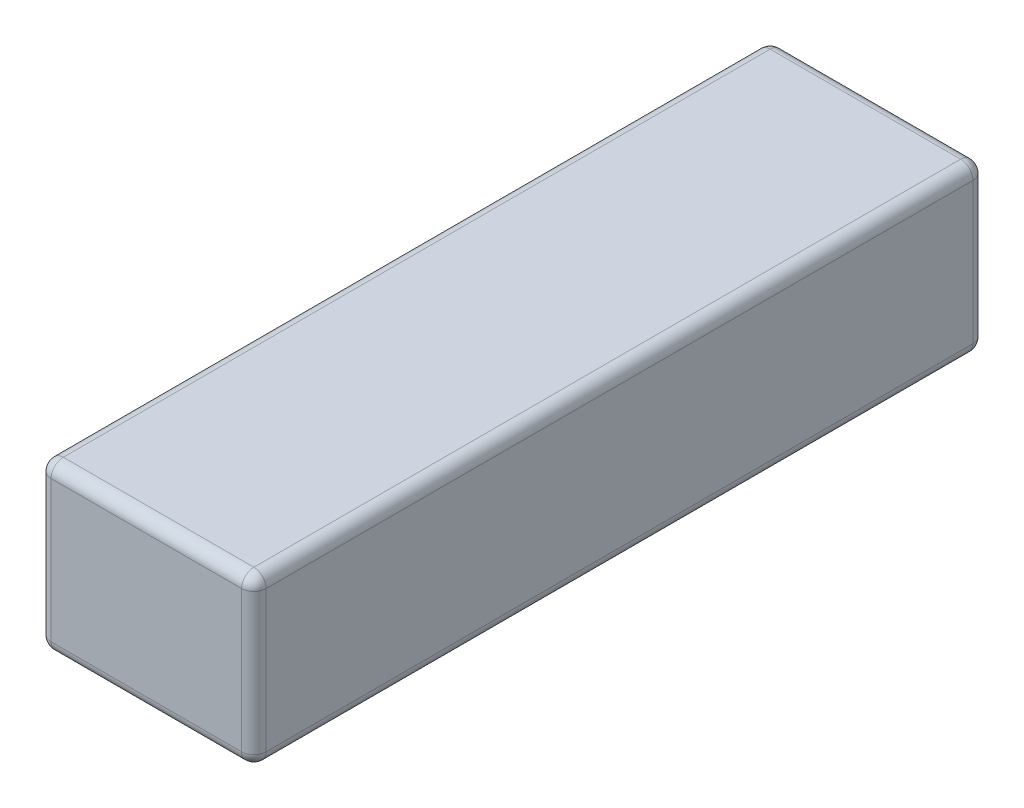
ISO-10303-21;
HEADER;
FILE_DESCRIPTION(('STEP AP214'),'2;1');
FILE_NAME('part.step','',(''),(''),'','','');
FILE_SCHEMA(('AUTOMOTIVE_DESIGN { 1 0 10303 214 1 1 1 1 }'));
ENDSEC;
DATA;
#1=APPLICATION_CONTEXT('core data for automotive mechanical design processes');
#2=APPLICATION_PROTOCOL_DEFINITION('international standard','automotive_design',2000,#1);
#3=PRODUCT_CONTEXT('',#1,'mechanical');
#4=PRODUCT('Part','Part','',(#3));
#5=PRODUCT_RELATED_PRODUCT_CATEGORY('part','',(#4));
#6=PRODUCT_DEFINITION_FORMATION('','',#4);
#7=PRODUCT_DEFINITION_CONTEXT('part definition',#1,'design');
#8=PRODUCT_DEFINITION('design','',#6,#7);
#9=PRODUCT_DEFINITION_SHAPE('','',#8);
#10=(LENGTH_UNIT() NAMED_UNIT(*) SI_UNIT(.MILLI.,.METRE.));
#11=(NAMED_UNIT(*) PLANE_ANGLE_UNIT() SI_UNIT($,.RADIAN.));
#12=(NAMED_UNIT(*) SI_UNIT($,.STERADIAN.) SOLID_ANGLE_UNIT());
#13=UNCERTAINTY_MEASURE_WITH_UNIT(LENGTH_MEASURE(1.E-05),#10,'distance_accuracy_value','');
#14=(GEOMETRIC_REPRESENTATION_CONTEXT(3) GLOBAL_UNCERTAINTY_ASSIGNED_CONTEXT((#13)) GLOBAL_UNIT_ASSIGNED_CONTEXT((#10,
#11,#12)) REPRESENTATION_CONTEXT('',''));
#15=CARTESIAN_POINT('',(0.,0.,0.));
#16=DIRECTION('',(0.,0.,1.));
#17=DIRECTION('',(1.,0.,0.));
#18=AXIS2_PLACEMENT_3D('',#15,#16,#17);
#19=CARTESIAN_POINT('',(-114.218920322243,54.8912600933029,119.));
#20=DIRECTION('',(1.,0.,0.));
#21=DIRECTION('',(0.,0.,-1.));
#22=AXIS2_PLACEMENT_3D('',#19,#20,#21);
#23=PLANE('',#22);
#24=DIRECTION('',(0.,-1.,0.));
#25=VECTOR('',#24,1.);
#26=CARTESIAN_POINT('',(-114.218920322243,54.8912600933029,2.));
#27=LINE('',#26,#25);
#28=CARTESIAN_POINT('',(-114.218920322243,52.8912600933029,2.));
#29=VERTEX_POINT('',#28);
#30=CARTESIAN_POINT('',(-114.218920322243,29.8912600933029,2.));
#31=VERTEX_POINT('',#30);
#32=EDGE_CURVE('E191',#29,#31,#27,.T.);
#33=ORIENTED_EDGE('',*,*,#32,.T.);
#34=DIRECTION('',(0.,0.,-1.));
#35=VECTOR('',#34,1.);
#36=CARTESIAN_POINT('',(-114.218920322243,29.8912600933029,119.));
#37=LINE('',#36,#35);
#38=CARTESIAN_POINT('',(-114.218920322243,29.8912600933029,117.));
#39=VERTEX_POINT('',#38);
#40=EDGE_CURVE('E194',#31,#39,#37,.F.);
#41=ORIENTED_EDGE('',*,*,#40,.T.);
#42=DIRECTION('',(0.,-1.,0.));
#43=VECTOR('',#42,1.);
#44=CARTESIAN_POINT('',(-114.218920322243,54.8912600933029,117.));
#45=LINE('',#44,#43);
#46=CARTESIAN_POINT('',(-114.218920322243,52.8912600933029,117.));
#47=VERTEX_POINT('',#46);
#48=EDGE_CURVE('E188',#39,#47,#45,.F.);
#49=ORIENTED_EDGE('',*,*,#48,.T.);
#50=DIRECTION('',(0.,0.,-1.));
#51=VECTOR('',#50,1.);
#52=CARTESIAN_POINT('',(-114.218920322243,52.8912600933029,119.));
#53=LINE('',#52,#51);
#54=EDGE_CURVE('E185',#47,#29,#53,.T.);
#55=ORIENTED_EDGE('',*,*,#54,.T.);
#56=EDGE_LOOP('',(#33,#41,#49,#55));
#57=FACE_BOUND('',#56,.T.);
#58=ADVANCED_FACE('F41',(#57),#23,.F.);
#59=CARTESIAN_POINT('',(-114.218920322243,27.8912600933029,119.));
#60=DIRECTION('',(0.,1.,0.));
#61=DIRECTION('',(0.,0.,1.));
#62=AXIS2_PLACEMENT_3D('',#59,#60,#61);
#63=PLANE('',#62);
#64=DIRECTION('',(0.,0.,-1.));
#65=VECTOR('',#64,1.);
#66=CARTESIAN_POINT('',(-112.218920322243,27.8912600933029,119.));
#67=LINE('',#66,#65);
#68=CARTESIAN_POINT('',(-112.218920322243,27.8912600933029,117.));
#69=VERTEX_POINT('',#68);
#70=CARTESIAN_POINT('',(-112.218920322243,27.8912600933029,2.));
#71=VERTEX_POINT('',#70);
#72=EDGE_CURVE('E166',#69,#71,#67,.T.);
#73=ORIENTED_EDGE('',*,*,#72,.T.);
#74=DIRECTION('',(1.,0.,0.));
#75=VECTOR('',#74,1.);
#76=CARTESIAN_POINT('',(-114.218920322243,27.8912600933029,2.));
#77=LINE('',#76,#75);
#78=CARTESIAN_POINT('',(-81.2189203222433,27.8912600933029,2.));
#79=VERTEX_POINT('',#78);
#80=EDGE_CURVE('E135',#71,#79,#77,.T.);
#81=ORIENTED_EDGE('',*,*,#80,.T.);
#82=DIRECTION('',(0.,0.,-1.));
#83=VECTOR('',#82,1.);
#84=CARTESIAN_POINT('',(-81.2189203222433,27.8912600933029,119.));
#85=LINE('',#84,#83);
#86=CARTESIAN_POINT('',(-81.2189203222433,27.8912600933029,117.));
#87=VERTEX_POINT('',#86);
#88=EDGE_CURVE('E155',#79,#87,#85,.F.);
#89=ORIENTED_EDGE('',*,*,#88,.T.);
#90=DIRECTION('',(1.,0.,0.));
#91=VECTOR('',#90,1.);
#92=CARTESIAN_POINT('',(-114.218920322243,27.8912600933029,117.));
#93=LINE('',#92,#91);
#94=EDGE_CURVE('E162',#87,#69,#93,.F.);
#95=ORIENTED_EDGE('',*,*,#94,.T.);
#96=EDGE_LOOP('',(#73,#81,#89,#95));
#97=FACE_BOUND('',#96,.T.);
#98=ADVANCED_FACE('F164',(#97),#63,.F.);
#99=CARTESIAN_POINT('',(-79.2189203222433,54.8912600933029,119.));
#100=DIRECTION('',(-1.,0.,0.));
#101=DIRECTION('',(0.,0.,1.));
#102=AXIS2_PLACEMENT_3D('',#99,#100,#101);
#103=PLANE('',#102);
#104=DIRECTION('',(0.,1.,0.));
#105=VECTOR('',#104,1.);
#106=CARTESIAN_POINT('',(-79.2189203222433,27.8912600933029,117.));
#107=LINE('',#106,#105);
#108=CARTESIAN_POINT('',(-79.2189203222433,52.8912600933029,117.));
#109=VERTEX_POINT('',#108);
#110=CARTESIAN_POINT('',(-79.2189203222433,29.8912600933029,117.));
#111=VERTEX_POINT('',#110);
#112=EDGE_CURVE('E217',#109,#111,#107,.F.);
#113=ORIENTED_EDGE('',*,*,#112,.T.);
#114=DIRECTION('',(0.,0.,-1.));
#115=VECTOR('',#114,1.);
#116=CARTESIAN_POINT('',(-79.2189203222433,29.8912600933029,119.));
#117=LINE('',#116,#115);
#118=CARTESIAN_POINT('',(-79.2189203222433,29.8912600933029,2.));
#119=VERTEX_POINT('',#118);
#120=EDGE_CURVE('E220',#111,#119,#117,.T.);
#121=ORIENTED_EDGE('',*,*,#120,.T.);
#122=DIRECTION('',(0.,1.,0.));
#123=VECTOR('',#122,1.);
#124=CARTESIAN_POINT('',(-79.2189203222433,54.8912600933029,2.));
#125=LINE('',#124,#123);
#126=CARTESIAN_POINT('',(-79.2189203222433,52.8912600933029,2.));
#127=VERTEX_POINT('',#126);
#128=EDGE_CURVE('E214',#119,#127,#125,.T.);
#129=ORIENTED_EDGE('',*,*,#128,.T.);
#130=DIRECTION('',(0.,0.,-1.));
#131=VECTOR('',#130,1.);
#132=CARTESIAN_POINT('',(-79.2189203222433,52.8912600933029,119.));
#133=LINE('',#132,#131);
#134=EDGE_CURVE('E211',#127,#109,#133,.F.);
#135=ORIENTED_EDGE('',*,*,#134,.T.);
#136=EDGE_LOOP('',(#113,#121,#129,#135));
#137=FACE_BOUND('',#136,.T.);
#138=ADVANCED_FACE('F384',(#137),#103,.F.);
#139=CARTESIAN_POINT('',(-114.218920322243,54.8912600933029,119.));
#140=DIRECTION('',(0.,-1.,0.));
#141=DIRECTION('',(0.,0.,-1.));
#142=AXIS2_PLACEMENT_3D('',#139,#140,#141);
#143=PLANE('',#142);
#144=DIRECTION('',(-1.,0.,0.));
#145=VECTOR('',#144,1.);
#146=CARTESIAN_POINT('',(-79.2189203222433,54.8912600933029,117.));
#147=LINE('',#146,#145);
#148=CARTESIAN_POINT('',(-112.218920322243,54.8912600933029,117.));
#149=VERTEX_POINT('',#148);
#150=CARTESIAN_POINT('',(-81.2189203222433,54.8912600933029,117.));
#151=VERTEX_POINT('',#150);
#152=EDGE_CURVE('E51',#149,#151,#147,.F.);
#153=ORIENTED_EDGE('',*,*,#152,.T.);
#154=DIRECTION('',(0.,0.,-1.));
#155=VECTOR('',#154,1.);
#156=CARTESIAN_POINT('',(-81.2189203222433,54.8912600933029,119.));
#157=LINE('',#156,#155);
#158=CARTESIAN_POINT('',(-81.2189203222433,54.8912600933029,2.));
#159=VERTEX_POINT('',#158);
#160=EDGE_CURVE('E11',#151,#159,#157,.T.);
#161=ORIENTED_EDGE('',*,*,#160,.T.);
#162=DIRECTION('',(-1.,0.,0.));
#163=VECTOR('',#162,1.);
#164=CARTESIAN_POINT('',(-114.218920322243,54.8912600933029,2.));
#165=LINE('',#164,#163);
#166=CARTESIAN_POINT('',(-112.218920322243,54.8912600933029,2.));
#167=VERTEX_POINT('',#166);
#168=EDGE_CURVE('E224',#159,#167,#165,.T.);
#169=ORIENTED_EDGE('',*,*,#168,.T.);
#170=DIRECTION('',(0.,0.,-1.));
#171=VECTOR('',#170,1.);
#172=CARTESIAN_POINT('',(-112.218920322243,54.8912600933029,119.));
#173=LINE('',#172,#171);
#174=EDGE_CURVE('E62',#167,#149,#173,.F.);
#175=ORIENTED_EDGE('',*,*,#174,.T.);
#176=EDGE_LOOP('',(#153,#161,#169,#175));
#177=FACE_BOUND('',#176,.T.);
#178=ADVANCED_FACE('F350',(#177),#143,.F.);
#179=CARTESIAN_POINT('',(0.,0.,119.));
#180=DIRECTION('',(0.,0.,1.));
#181=DIRECTION('',(1.,0.,0.));
#182=AXIS2_PLACEMENT_3D('',#179,#180,#181);
#183=PLANE('',#182);
#184=DIRECTION('',(0.,-1.,0.));
#185=VECTOR('',#184,1.);
#186=CARTESIAN_POINT('',(-112.218920322243,27.8912600933029,119.));
#187=LINE('',#186,#185);
#188=CARTESIAN_POINT('',(-112.218920322243,52.8912600933029,119.));
#189=VERTEX_POINT('',#188);
#190=CARTESIAN_POINT('',(-112.218920322243,29.8912600933029,119.));
#191=VERTEX_POINT('',#190);
#192=EDGE_CURVE('E204',#189,#191,#187,.T.);
#193=ORIENTED_EDGE('',*,*,#192,.T.);
#194=DIRECTION('',(1.,0.,0.));
#195=VECTOR('',#194,1.);
#196=CARTESIAN_POINT('',(-79.2189203222433,29.8912600933029,119.));
#197=LINE('',#196,#195);
#198=CARTESIAN_POINT('',(-81.2189203222433,29.8912600933029,119.));
#199=VERTEX_POINT('',#198);
#200=EDGE_CURVE('E207',#191,#199,#197,.T.);
#201=ORIENTED_EDGE('',*,*,#200,.T.);
#202=DIRECTION('',(0.,1.,0.));
#203=VECTOR('',#202,1.);
#204=CARTESIAN_POINT('',(-81.2189203222433,54.8912600933029,119.));
#205=LINE('',#204,#203);
#206=CARTESIAN_POINT('',(-81.2189203222433,52.8912600933029,119.));
#207=VERTEX_POINT('',#206);
#208=EDGE_CURVE('E201',#199,#207,#205,.T.);
#209=ORIENTED_EDGE('',*,*,#208,.T.);
#210=DIRECTION('',(-1.,0.,0.));
#211=VECTOR('',#210,1.);
#212=CARTESIAN_POINT('',(-114.218920322243,52.8912600933029,119.));
#213=LINE('',#212,#211);
#214=EDGE_CURVE('E198',#207,#189,#213,.T.);
#215=ORIENTED_EDGE('',*,*,#214,.T.);
#216=EDGE_LOOP('',(#193,#201,#209,#215));
#217=FACE_BOUND('',#216,.T.);
#218=ADVANCED_FACE('F331',(#217),#183,.T.);
#219=CARTESIAN_POINT('',(0.,0.,0.));
#220=DIRECTION('',(0.,0.,1.));
#221=DIRECTION('',(1.,0.,0.));
#222=AXIS2_PLACEMENT_3D('',#219,#220,#221);
#223=PLANE('',#222);
#224=DIRECTION('',(0.,1.,0.));
#225=VECTOR('',#224,1.);
#226=CARTESIAN_POINT('',(-81.2189203222433,0.,0.));
#227=LINE('',#226,#225);
#228=CARTESIAN_POINT('',(-81.2189203222433,52.8912600933029,0.));
#229=VERTEX_POINT('',#228);
#230=CARTESIAN_POINT('',(-81.2189203222433,29.8912600933029,0.));
#231=VERTEX_POINT('',#230);
#232=EDGE_CURVE('E173',#229,#231,#227,.F.);
#233=ORIENTED_EDGE('',*,*,#232,.T.);
#234=DIRECTION('',(1.,0.,0.));
#235=VECTOR('',#234,1.);
#236=CARTESIAN_POINT('',(0.,29.8912600933029,0.));
#237=LINE('',#236,#235);
#238=CARTESIAN_POINT('',(-112.218920322243,29.8912600933029,0.));
#239=VERTEX_POINT('',#238);
#240=EDGE_CURVE('E137',#231,#239,#237,.F.);
#241=ORIENTED_EDGE('',*,*,#240,.T.);
#242=DIRECTION('',(0.,-1.,0.));
#243=VECTOR('',#242,1.);
#244=CARTESIAN_POINT('',(-112.218920322243,0.,0.));
#245=LINE('',#244,#243);
#246=CARTESIAN_POINT('',(-112.218920322243,52.8912600933029,0.));
#247=VERTEX_POINT('',#246);
#248=EDGE_CURVE('E180',#239,#247,#245,.F.);
#249=ORIENTED_EDGE('',*,*,#248,.T.);
#250=DIRECTION('',(-1.,0.,0.));
#251=VECTOR('',#250,1.);
#252=CARTESIAN_POINT('',(0.,52.8912600933029,0.));
#253=LINE('',#252,#251);
#254=EDGE_CURVE('E169',#247,#229,#253,.F.);
#255=ORIENTED_EDGE('',*,*,#254,.T.);
#256=EDGE_LOOP('',(#233,#241,#249,#255));
#257=FACE_BOUND('',#256,.T.);
#258=ADVANCED_FACE('F410',(#257),#223,.F.);
#259=CARTESIAN_POINT('',(0.,52.8912600933029,117.));
#260=DIRECTION('',(1.,0.,0.));
#261=DIRECTION('',(0.,0.,-1.));
#262=AXIS2_PLACEMENT_3D('',#259,#260,#261);
#263=CYLINDRICAL_SURFACE('',#262,2.);
#264=CARTESIAN_POINT('',(-112.218920322243,52.8912600933029,117.));
#265=DIRECTION('',(-1.,0.,0.));
#266=DIRECTION('',(0.,0.,1.));
#267=AXIS2_PLACEMENT_3D('',#264,#265,#266);
#268=CIRCLE('',#267,2.);
#269=EDGE_CURVE('E45',#189,#149,#268,.T.);
#270=ORIENTED_EDGE('',*,*,#269,.F.);
#271=ORIENTED_EDGE('',*,*,#214,.F.);
#272=CARTESIAN_POINT('',(-81.2189203222433,52.8912600933029,117.));
#273=DIRECTION('',(1.,0.,0.));
#274=DIRECTION('',(0.,0.,-1.));
#275=AXIS2_PLACEMENT_3D('',#272,#273,#274);
#276=CIRCLE('',#275,2.);
#277=EDGE_CURVE('E300',#151,#207,#276,.T.);
#278=ORIENTED_EDGE('',*,*,#277,.F.);
#279=ORIENTED_EDGE('',*,*,#152,.F.);
#280=EDGE_LOOP('',(#270,#271,#278,#279));
#281=FACE_BOUND('',#280,.T.);
#282=ADVANCED_FACE('F43',(#281),#263,.T.);
#283=CARTESIAN_POINT('',(-112.218920322243,52.8912600933029,117.));
#284=DIRECTION('',(0.,0.,1.));
#285=DIRECTION('',(1.,0.,0.));
#286=AXIS2_PLACEMENT_3D('',#283,#284,#285);
#287=SPHERICAL_SURFACE('',#286,2.);
#288=CARTESIAN_POINT('',(-112.218920322243,52.8912600933029,117.));
#289=DIRECTION('',(0.,1.,0.));
#290=DIRECTION('',(0.,0.,1.));
#291=AXIS2_PLACEMENT_3D('',#288,#289,#290);
#292=CIRCLE('',#291,2.);
#293=EDGE_CURVE('E293',#189,#47,#292,.F.);
#294=ORIENTED_EDGE('',*,*,#293,.F.);
#295=ORIENTED_EDGE('',*,*,#269,.T.);
#296=CARTESIAN_POINT('',(-112.218920322243,52.8912600933029,117.));
#297=DIRECTION('',(0.,0.,1.));
#298=DIRECTION('',(1.,0.,0.));
#299=AXIS2_PLACEMENT_3D('',#296,#297,#298);
#300=CIRCLE('',#299,2.);
#301=EDGE_CURVE('E297',#47,#149,#300,.F.);
#302=ORIENTED_EDGE('',*,*,#301,.F.);
#303=EDGE_LOOP('',(#294,#295,#302));
#304=FACE_BOUND('',#303,.T.);
#305=ADVANCED_FACE('F312',(#304),#287,.T.);
#306=CARTESIAN_POINT('',(-81.2189203222433,52.8912600933029,117.));
#307=DIRECTION('',(0.,0.,1.));
#308=DIRECTION('',(1.,0.,0.));
#309=AXIS2_PLACEMENT_3D('',#306,#307,#308);
#310=SPHERICAL_SURFACE('',#309,2.);
#311=CARTESIAN_POINT('',(-81.2189203222433,52.8912600933029,117.));
#312=DIRECTION('',(0.,0.,1.));
#313=DIRECTION('',(1.,0.,0.));
#314=AXIS2_PLACEMENT_3D('',#311,#312,#313);
#315=CIRCLE('',#314,2.);
#316=EDGE_CURVE('E285',#151,#109,#315,.F.);
#317=ORIENTED_EDGE('',*,*,#316,.F.);
#318=ORIENTED_EDGE('',*,*,#277,.T.);
#319=CARTESIAN_POINT('',(-81.2189203222433,52.8912600933029,117.));
#320=DIRECTION('',(0.,1.,0.));
#321=DIRECTION('',(0.,0.,1.));
#322=AXIS2_PLACEMENT_3D('',#319,#320,#321);
#323=CIRCLE('',#322,2.);
#324=EDGE_CURVE('E289',#109,#207,#323,.F.);
#325=ORIENTED_EDGE('',*,*,#324,.F.);
#326=EDGE_LOOP('',(#317,#318,#325));
#327=FACE_BOUND('',#326,.T.);
#328=ADVANCED_FACE('F344',(#327),#310,.T.);
#329=CARTESIAN_POINT('',(-112.218920322243,52.8912600933029,119.));
#330=DIRECTION('',(0.,0.,-1.));
#331=DIRECTION('',(-1.,0.,0.));
#332=AXIS2_PLACEMENT_3D('',#329,#330,#331);
#333=CYLINDRICAL_SURFACE('',#332,2.);
#334=ORIENTED_EDGE('',*,*,#301,.T.);
#335=ORIENTED_EDGE('',*,*,#174,.F.);
#336=CARTESIAN_POINT('',(-112.218920322243,52.8912600933029,2.));
#337=DIRECTION('',(0.,0.,-1.));
#338=DIRECTION('',(-1.,0.,0.));
#339=AXIS2_PLACEMENT_3D('',#336,#337,#338);
#340=CIRCLE('',#339,2.);
#341=EDGE_CURVE('E277',#29,#167,#340,.T.);
#342=ORIENTED_EDGE('',*,*,#341,.F.);
#343=ORIENTED_EDGE('',*,*,#54,.F.);
#344=EDGE_LOOP('',(#334,#335,#342,#343));
#345=FACE_BOUND('',#344,.T.);
#346=ADVANCED_FACE('F318',(#345),#333,.T.);
#347=CARTESIAN_POINT('',(-112.218920322243,0.,117.));
#348=DIRECTION('',(0.,1.,0.));
#349=DIRECTION('',(0.,0.,1.));
#350=AXIS2_PLACEMENT_3D('',#347,#348,#349);
#351=CYLINDRICAL_SURFACE('',#350,2.);
#352=ORIENTED_EDGE('',*,*,#293,.T.);
#353=ORIENTED_EDGE('',*,*,#48,.F.);
#354=CARTESIAN_POINT('',(-112.218920322243,29.8912600933029,117.));
#355=DIRECTION('',(0.,-1.,0.));
#356=DIRECTION('',(0.,0.,-1.));
#357=AXIS2_PLACEMENT_3D('',#354,#355,#356);
#358=CIRCLE('',#357,2.);
#359=EDGE_CURVE('E273',#191,#39,#358,.T.);
#360=ORIENTED_EDGE('',*,*,#359,.F.);
#361=ORIENTED_EDGE('',*,*,#192,.F.);
#362=EDGE_LOOP('',(#352,#353,#360,#361));
#363=FACE_BOUND('',#362,.T.);
#364=ADVANCED_FACE('F328',(#363),#351,.T.);
#365=CARTESIAN_POINT('',(0.,29.8912600933029,117.));
#366=DIRECTION('',(-1.,0.,0.));
#367=DIRECTION('',(0.,0.,1.));
#368=AXIS2_PLACEMENT_3D('',#365,#366,#367);
#369=CYLINDRICAL_SURFACE('',#368,2.);
#370=CARTESIAN_POINT('',(-81.2189203222433,29.8912600933029,117.));
#371=DIRECTION('',(1.,0.,0.));
#372=DIRECTION('',(0.,0.,-1.));
#373=AXIS2_PLACEMENT_3D('',#370,#371,#372);
#374=CIRCLE('',#373,2.);
#375=EDGE_CURVE('E265',#199,#87,#374,.T.);
#376=ORIENTED_EDGE('',*,*,#375,.F.);
#377=ORIENTED_EDGE('',*,*,#200,.F.);
#378=CARTESIAN_POINT('',(-112.218920322243,29.8912600933029,117.));
#379=DIRECTION('',(-1.,0.,0.));
#380=DIRECTION('',(0.,0.,1.));
#381=AXIS2_PLACEMENT_3D('',#378,#379,#380);
#382=CIRCLE('',#381,2.);
#383=EDGE_CURVE('E269',#69,#191,#382,.T.);
#384=ORIENTED_EDGE('',*,*,#383,.F.);
#385=ORIENTED_EDGE('',*,*,#94,.F.);
#386=EDGE_LOOP('',(#376,#377,#384,#385));
#387=FACE_BOUND('',#386,.T.);
#388=ADVANCED_FACE('F335',(#387),#369,.T.);
#389=CARTESIAN_POINT('',(-81.2189203222433,0.,117.));
#390=DIRECTION('',(0.,-1.,0.));
#391=DIRECTION('',(0.,0.,-1.));
#392=AXIS2_PLACEMENT_3D('',#389,#390,#391);
#393=CYLINDRICAL_SURFACE('',#392,2.);
#394=ORIENTED_EDGE('',*,*,#324,.T.);
#395=ORIENTED_EDGE('',*,*,#208,.F.);
#396=CARTESIAN_POINT('',(-81.2189203222433,29.8912600933029,117.));
#397=DIRECTION('',(0.,-1.,0.));
#398=DIRECTION('',(0.,0.,-1.));
#399=AXIS2_PLACEMENT_3D('',#396,#397,#398);
#400=CIRCLE('',#399,2.);
#401=EDGE_CURVE('E262',#111,#199,#400,.T.);
#402=ORIENTED_EDGE('',*,*,#401,.F.);
#403=ORIENTED_EDGE('',*,*,#112,.F.);
#404=EDGE_LOOP('',(#394,#395,#402,#403));
#405=FACE_BOUND('',#404,.T.);
#406=ADVANCED_FACE('F341',(#405),#393,.T.);
#407=CARTESIAN_POINT('',(-81.2189203222433,52.8912600933029,119.));
#408=DIRECTION('',(0.,0.,-1.));
#409=DIRECTION('',(-1.,0.,0.));
#410=AXIS2_PLACEMENT_3D('',#407,#408,#409);
#411=CYLINDRICAL_SURFACE('',#410,2.);
#412=ORIENTED_EDGE('',*,*,#316,.T.);
#413=ORIENTED_EDGE('',*,*,#134,.F.);
#414=CARTESIAN_POINT('',(-81.2189203222433,52.8912600933029,2.));
#415=DIRECTION('',(0.,0.,-1.));
#416=DIRECTION('',(-1.,0.,0.));
#417=AXIS2_PLACEMENT_3D('',#414,#415,#416);
#418=CIRCLE('',#417,2.);
#419=EDGE_CURVE('E258',#159,#127,#418,.T.);
#420=ORIENTED_EDGE('',*,*,#419,.F.);
#421=ORIENTED_EDGE('',*,*,#160,.F.);
#422=EDGE_LOOP('',(#412,#413,#420,#421));
#423=FACE_BOUND('',#422,.T.);
#424=ADVANCED_FACE('F348',(#423),#411,.T.);
#425=CARTESIAN_POINT('',(-114.218920322243,52.8912600933029,2.));
#426=DIRECTION('',(-1.,0.,0.));
#427=DIRECTION('',(0.,0.,1.));
#428=AXIS2_PLACEMENT_3D('',#425,#426,#427);
#429=CYLINDRICAL_SURFACE('',#428,2.);
#430=CARTESIAN_POINT('',(-112.218920322243,52.8912600933029,2.));
#431=DIRECTION('',(-1.,0.,0.));
#432=DIRECTION('',(0.,0.,1.));
#433=AXIS2_PLACEMENT_3D('',#430,#431,#432);
#434=CIRCLE('',#433,2.);
#435=EDGE_CURVE('E281',#167,#247,#434,.T.);
#436=ORIENTED_EDGE('',*,*,#435,.F.);
#437=ORIENTED_EDGE('',*,*,#168,.F.);
#438=CARTESIAN_POINT('',(-81.2189203222433,52.8912600933029,2.));
#439=DIRECTION('',(1.,0.,0.));
#440=DIRECTION('',(0.,0.,-1.));
#441=AXIS2_PLACEMENT_3D('',#438,#439,#440);
#442=CIRCLE('',#441,2.);
#443=EDGE_CURVE('E255',#229,#159,#442,.T.);
#444=ORIENTED_EDGE('',*,*,#443,.F.);
#445=ORIENTED_EDGE('',*,*,#254,.F.);
#446=EDGE_LOOP('',(#436,#437,#444,#445));
#447=FACE_BOUND('',#446,.T.);
#448=ADVANCED_FACE('F353',(#447),#429,.T.);
#449=CARTESIAN_POINT('',(-112.218920322243,52.8912600933029,2.));
#450=DIRECTION('',(0.,0.,1.));
#451=DIRECTION('',(1.,0.,0.));
#452=AXIS2_PLACEMENT_3D('',#449,#450,#451);
#453=SPHERICAL_SURFACE('',#452,2.);
#454=ORIENTED_EDGE('',*,*,#341,.T.);
#455=ORIENTED_EDGE('',*,*,#435,.T.);
#456=CARTESIAN_POINT('',(-112.218920322243,52.8912600933029,2.));
#457=DIRECTION('',(0.,1.,0.));
#458=DIRECTION('',(0.,0.,1.));
#459=AXIS2_PLACEMENT_3D('',#456,#457,#458);
#460=CIRCLE('',#459,2.);
#461=EDGE_CURVE('E251',#29,#247,#460,.F.);
#462=ORIENTED_EDGE('',*,*,#461,.F.);
#463=EDGE_LOOP('',(#454,#455,#462));
#464=FACE_BOUND('',#463,.T.);
#465=ADVANCED_FACE('F357',(#464),#453,.T.);
#466=CARTESIAN_POINT('',(-112.218920322243,29.8912600933029,117.));
#467=DIRECTION('',(0.,0.,1.));
#468=DIRECTION('',(1.,0.,0.));
#469=AXIS2_PLACEMENT_3D('',#466,#467,#468);
#470=SPHERICAL_SURFACE('',#469,2.);
#471=ORIENTED_EDGE('',*,*,#383,.T.);
#472=ORIENTED_EDGE('',*,*,#359,.T.);
#473=CARTESIAN_POINT('',(-112.218920322243,29.8912600933029,117.));
#474=DIRECTION('',(0.,0.,1.));
#475=DIRECTION('',(1.,0.,0.));
#476=AXIS2_PLACEMENT_3D('',#473,#474,#475);
#477=CIRCLE('',#476,2.);
#478=EDGE_CURVE('E248',#69,#39,#477,.F.);
#479=ORIENTED_EDGE('',*,*,#478,.F.);
#480=EDGE_LOOP('',(#471,#472,#479));
#481=FACE_BOUND('',#480,.T.);
#482=ADVANCED_FACE('F368',(#481),#470,.T.);
#483=CARTESIAN_POINT('',(-81.2189203222433,29.8912600933029,117.));
#484=DIRECTION('',(0.,0.,1.));
#485=DIRECTION('',(1.,0.,0.));
#486=AXIS2_PLACEMENT_3D('',#483,#484,#485);
#487=SPHERICAL_SURFACE('',#486,2.);
#488=ORIENTED_EDGE('',*,*,#401,.T.);
#489=ORIENTED_EDGE('',*,*,#375,.T.);
#490=CARTESIAN_POINT('',(-81.2189203222433,29.8912600933029,117.));
#491=DIRECTION('',(0.,0.,1.));
#492=DIRECTION('',(1.,0.,0.));
#493=AXIS2_PLACEMENT_3D('',#490,#491,#492);
#494=CIRCLE('',#493,2.);
#495=EDGE_CURVE('E158',#111,#87,#494,.F.);
#496=ORIENTED_EDGE('',*,*,#495,.F.);
#497=EDGE_LOOP('',(#488,#489,#496));
#498=FACE_BOUND('',#497,.T.);
#499=ADVANCED_FACE('F370',(#498),#487,.T.);
#500=CARTESIAN_POINT('',(-81.2189203222433,52.8912600933029,2.));
#501=DIRECTION('',(0.,0.,1.));
#502=DIRECTION('',(1.,0.,0.));
#503=AXIS2_PLACEMENT_3D('',#500,#501,#502);
#504=SPHERICAL_SURFACE('',#503,2.);
#505=ORIENTED_EDGE('',*,*,#443,.T.);
#506=ORIENTED_EDGE('',*,*,#419,.T.);
#507=CARTESIAN_POINT('',(-81.2189203222433,52.8912600933029,2.));
#508=DIRECTION('',(0.,1.,0.));
#509=DIRECTION('',(0.,0.,1.));
#510=AXIS2_PLACEMENT_3D('',#507,#508,#509);
#511=CIRCLE('',#510,2.);
#512=EDGE_CURVE('E242',#229,#127,#511,.F.);
#513=ORIENTED_EDGE('',*,*,#512,.F.);
#514=EDGE_LOOP('',(#505,#506,#513));
#515=FACE_BOUND('',#514,.T.);
#516=ADVANCED_FACE('F376',(#515),#504,.T.);
#517=CARTESIAN_POINT('',(-112.218920322243,54.8912600933029,2.));
#518=DIRECTION('',(0.,-1.,0.));
#519=DIRECTION('',(0.,0.,-1.));
#520=AXIS2_PLACEMENT_3D('',#517,#518,#519);
#521=CYLINDRICAL_SURFACE('',#520,2.);
#522=ORIENTED_EDGE('',*,*,#461,.T.);
#523=ORIENTED_EDGE('',*,*,#248,.F.);
#524=CARTESIAN_POINT('',(-112.218920322243,29.8912600933029,2.));
#525=DIRECTION('',(0.,-1.,0.));
#526=DIRECTION('',(0.,0.,-1.));
#527=AXIS2_PLACEMENT_3D('',#524,#525,#526);
#528=CIRCLE('',#527,2.);
#529=EDGE_CURVE('E238',#31,#239,#528,.T.);
#530=ORIENTED_EDGE('',*,*,#529,.F.);
#531=ORIENTED_EDGE('',*,*,#32,.F.);
#532=EDGE_LOOP('',(#522,#523,#530,#531));
#533=FACE_BOUND('',#532,.T.);
#534=ADVANCED_FACE('F361',(#533),#521,.T.);
#535=CARTESIAN_POINT('',(-112.218920322243,29.8912600933029,119.));
#536=DIRECTION('',(0.,0.,-1.));
#537=DIRECTION('',(-1.,0.,0.));
#538=AXIS2_PLACEMENT_3D('',#535,#536,#537);
#539=CYLINDRICAL_SURFACE('',#538,2.);
#540=ORIENTED_EDGE('',*,*,#478,.T.);
#541=ORIENTED_EDGE('',*,*,#40,.F.);
#542=CARTESIAN_POINT('',(-112.218920322243,29.8912600933029,2.));
#543=DIRECTION('',(0.,0.,-1.));
#544=DIRECTION('',(-1.,0.,0.));
#545=AXIS2_PLACEMENT_3D('',#542,#543,#544);
#546=CIRCLE('',#545,2.);
#547=EDGE_CURVE('E152',#71,#31,#546,.T.);
#548=ORIENTED_EDGE('',*,*,#547,.F.);
#549=ORIENTED_EDGE('',*,*,#72,.F.);
#550=EDGE_LOOP('',(#540,#541,#548,#549));
#551=FACE_BOUND('',#550,.T.);
#552=ADVANCED_FACE('F366',(#551),#539,.T.);
#553=CARTESIAN_POINT('',(-81.2189203222433,29.8912600933029,119.));
#554=DIRECTION('',(0.,0.,-1.));
#555=DIRECTION('',(-1.,0.,0.));
#556=AXIS2_PLACEMENT_3D('',#553,#554,#555);
#557=CYLINDRICAL_SURFACE('',#556,2.);
#558=ORIENTED_EDGE('',*,*,#495,.T.);
#559=ORIENTED_EDGE('',*,*,#88,.F.);
#560=CARTESIAN_POINT('',(-81.2189203222433,29.8912600933029,2.));
#561=DIRECTION('',(0.,0.,-1.));
#562=DIRECTION('',(-1.,0.,0.));
#563=AXIS2_PLACEMENT_3D('',#560,#561,#562);
#564=CIRCLE('',#563,2.);
#565=EDGE_CURVE('E143',#119,#79,#564,.T.);
#566=ORIENTED_EDGE('',*,*,#565,.F.);
#567=ORIENTED_EDGE('',*,*,#120,.F.);
#568=EDGE_LOOP('',(#558,#559,#566,#567));
#569=FACE_BOUND('',#568,.T.);
#570=ADVANCED_FACE('F156',(#569),#557,.T.);
#571=CARTESIAN_POINT('',(-81.2189203222433,54.8912600933029,2.));
#572=DIRECTION('',(0.,1.,0.));
#573=DIRECTION('',(0.,0.,1.));
#574=AXIS2_PLACEMENT_3D('',#571,#572,#573);
#575=CYLINDRICAL_SURFACE('',#574,2.);
#576=ORIENTED_EDGE('',*,*,#512,.T.);
#577=ORIENTED_EDGE('',*,*,#128,.F.);
#578=CARTESIAN_POINT('',(-81.2189203222433,29.8912600933029,2.));
#579=DIRECTION('',(0.,-1.,0.));
#580=DIRECTION('',(0.,0.,-1.));
#581=AXIS2_PLACEMENT_3D('',#578,#579,#580);
#582=CIRCLE('',#581,2.);
#583=EDGE_CURVE('E147',#231,#119,#582,.T.);
#584=ORIENTED_EDGE('',*,*,#583,.F.);
#585=ORIENTED_EDGE('',*,*,#232,.F.);
#586=EDGE_LOOP('',(#576,#577,#584,#585));
#587=FACE_BOUND('',#586,.T.);
#588=ADVANCED_FACE('F394',(#587),#575,.T.);
#589=CARTESIAN_POINT('',(-112.218920322243,29.8912600933029,2.));
#590=DIRECTION('',(0.,0.,1.));
#591=DIRECTION('',(1.,0.,0.));
#592=AXIS2_PLACEMENT_3D('',#589,#590,#591);
#593=SPHERICAL_SURFACE('',#592,2.);
#594=ORIENTED_EDGE('',*,*,#547,.T.);
#595=ORIENTED_EDGE('',*,*,#529,.T.);
#596=CARTESIAN_POINT('',(-112.218920322243,29.8912600933029,2.));
#597=DIRECTION('',(-1.,0.,0.));
#598=DIRECTION('',(0.,0.,1.));
#599=AXIS2_PLACEMENT_3D('',#596,#597,#598);
#600=CIRCLE('',#599,2.);
#601=EDGE_CURVE('E140',#71,#239,#600,.F.);
#602=ORIENTED_EDGE('',*,*,#601,.F.);
#603=EDGE_LOOP('',(#594,#595,#602));
#604=FACE_BOUND('',#603,.T.);
#605=ADVANCED_FACE('F364',(#604),#593,.T.);
#606=CARTESIAN_POINT('',(-81.2189203222433,29.8912600933029,2.));
#607=DIRECTION('',(0.,0.,1.));
#608=DIRECTION('',(1.,0.,0.));
#609=AXIS2_PLACEMENT_3D('',#606,#607,#608);
#610=SPHERICAL_SURFACE('',#609,2.);
#611=ORIENTED_EDGE('',*,*,#583,.T.);
#612=ORIENTED_EDGE('',*,*,#565,.T.);
#613=CARTESIAN_POINT('',(-81.2189203222433,29.8912600933029,2.));
#614=DIRECTION('',(1.,0.,0.));
#615=DIRECTION('',(0.,0.,-1.));
#616=AXIS2_PLACEMENT_3D('',#613,#614,#615);
#617=CIRCLE('',#616,2.);
#618=EDGE_CURVE('E131',#231,#79,#617,.F.);
#619=ORIENTED_EDGE('',*,*,#618,.F.);
#620=EDGE_LOOP('',(#611,#612,#619));
#621=FACE_BOUND('',#620,.T.);
#622=ADVANCED_FACE('F145',(#621),#610,.T.);
#623=CARTESIAN_POINT('',(-114.218920322243,29.8912600933029,2.));
#624=DIRECTION('',(1.,0.,0.));
#625=DIRECTION('',(0.,0.,-1.));
#626=AXIS2_PLACEMENT_3D('',#623,#624,#625);
#627=CYLINDRICAL_SURFACE('',#626,2.);
#628=ORIENTED_EDGE('',*,*,#601,.T.);
#629=ORIENTED_EDGE('',*,*,#240,.F.);
#630=ORIENTED_EDGE('',*,*,#618,.T.);
#631=ORIENTED_EDGE('',*,*,#80,.F.);
#632=EDGE_LOOP('',(#628,#629,#630,#631));
#633=FACE_BOUND('',#632,.T.);
#634=ADVANCED_FACE('F133',(#633),#627,.T.);
#635=CLOSED_SHELL('',(#58,#98,#138,#178,#218,#258,#282,#305,#328,#346,#364,#388,#406,#424,#448,
#465,#482,#499,#516,#534,#552,#570,#588,#605,#622,#634));
#636=MANIFOLD_SOLID_BREP('B2',#635);
#637=ADVANCED_BREP_SHAPE_REPRESENTATION('',(#18,#636),#14);
#638=SHAPE_DEFINITION_REPRESENTATION(#9,#637);
ENDSEC;
END-ISO-10303-21;
